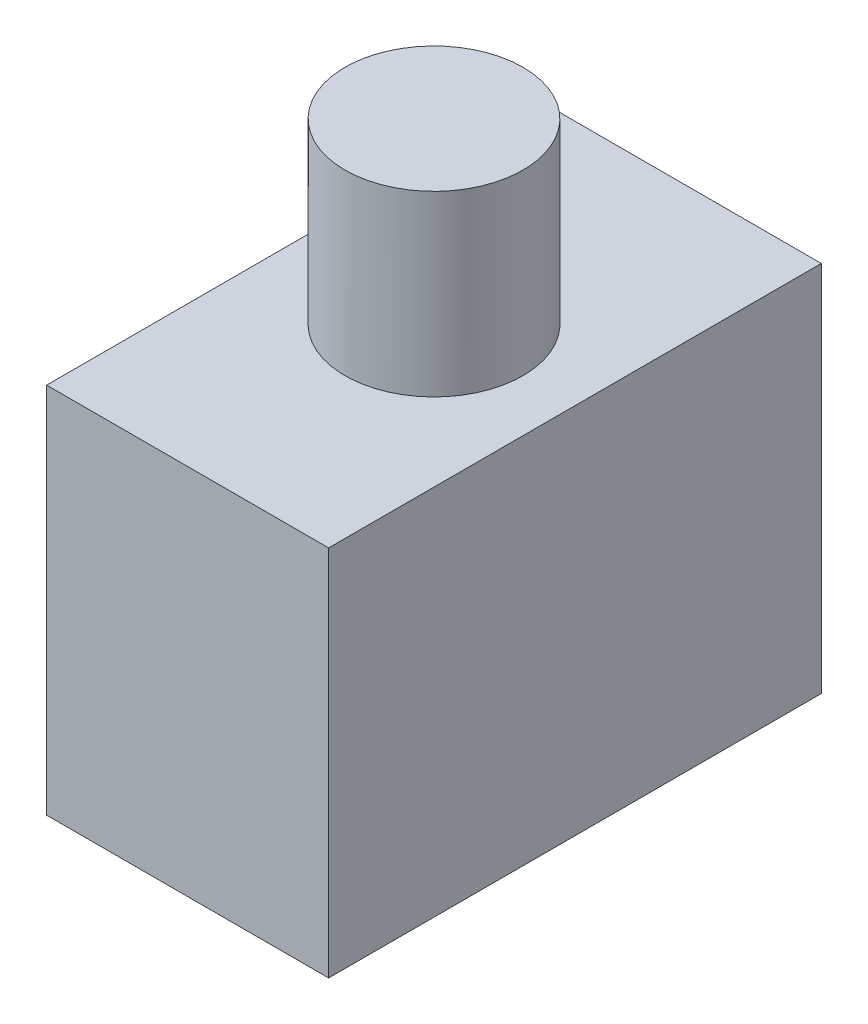
ISO-10303-21;
HEADER;
FILE_DESCRIPTION(('STEP AP214'),'2;1');
FILE_NAME('part.step','',(''),(''),'','','');
FILE_SCHEMA(('AUTOMOTIVE_DESIGN { 1 0 10303 214 1 1 1 1 }'));
ENDSEC;
DATA;
#1=APPLICATION_CONTEXT('core data for automotive mechanical design processes');
#2=APPLICATION_PROTOCOL_DEFINITION('international standard','automotive_design',2000,#1);
#3=PRODUCT_CONTEXT('',#1,'mechanical');
#4=PRODUCT('Part','Part','',(#3));
#5=PRODUCT_RELATED_PRODUCT_CATEGORY('part','',(#4));
#6=PRODUCT_DEFINITION_FORMATION('','',#4);
#7=PRODUCT_DEFINITION_CONTEXT('part definition',#1,'design');
#8=PRODUCT_DEFINITION('design','',#6,#7);
#9=PRODUCT_DEFINITION_SHAPE('','',#8);
#10=(LENGTH_UNIT() NAMED_UNIT(*) SI_UNIT(.MILLI.,.METRE.));
#11=(NAMED_UNIT(*) PLANE_ANGLE_UNIT() SI_UNIT($,.RADIAN.));
#12=(NAMED_UNIT(*) SI_UNIT($,.STERADIAN.) SOLID_ANGLE_UNIT());
#13=UNCERTAINTY_MEASURE_WITH_UNIT(LENGTH_MEASURE(1.E-05),#10,'distance_accuracy_value','');
#14=(GEOMETRIC_REPRESENTATION_CONTEXT(3) GLOBAL_UNCERTAINTY_ASSIGNED_CONTEXT((#13)) GLOBAL_UNIT_ASSIGNED_CONTEXT((#10,
#11,#12)) REPRESENTATION_CONTEXT('',''));
#15=CARTESIAN_POINT('',(0.,0.,0.));
#16=DIRECTION('',(0.,0.,1.));
#17=DIRECTION('',(1.,0.,0.));
#18=AXIS2_PLACEMENT_3D('',#15,#16,#17);
#19=CARTESIAN_POINT('',(9.5,25.1,-16.6));
#20=DIRECTION('',(0.,-1.,0.));
#21=DIRECTION('',(0.,0.,-1.));
#22=AXIS2_PLACEMENT_3D('',#19,#20,#21);
#23=PLANE('',#22);
#24=DIRECTION('',(0.,0.,-1.));
#25=VECTOR('',#24,1.);
#26=CARTESIAN_POINT('',(9.5,25.1,16.6));
#27=LINE('',#26,#25);
#28=CARTESIAN_POINT('',(9.5,25.1,16.6));
#29=VERTEX_POINT('',#28);
#30=CARTESIAN_POINT('',(9.5,25.1,-16.6));
#31=VERTEX_POINT('',#30);
#32=EDGE_CURVE('E86',#29,#31,#27,.T.);
#33=ORIENTED_EDGE('',*,*,#32,.T.);
#34=DIRECTION('',(-1.,0.,0.));
#35=VECTOR('',#34,1.);
#36=CARTESIAN_POINT('',(-9.5,25.1,-16.6));
#37=LINE('',#36,#35);
#38=CARTESIAN_POINT('',(-9.5,25.1,-16.6));
#39=VERTEX_POINT('',#38);
#40=EDGE_CURVE('E81',#31,#39,#37,.T.);
#41=ORIENTED_EDGE('',*,*,#40,.T.);
#42=DIRECTION('',(0.,0.,1.));
#43=VECTOR('',#42,1.);
#44=CARTESIAN_POINT('',(-9.5,25.1,16.6));
#45=LINE('',#44,#43);
#46=CARTESIAN_POINT('',(-9.5,25.1,16.6));
#47=VERTEX_POINT('',#46);
#48=EDGE_CURVE('E84',#39,#47,#45,.T.);
#49=ORIENTED_EDGE('',*,*,#48,.T.);
#50=DIRECTION('',(1.,0.,0.));
#51=VECTOR('',#50,1.);
#52=CARTESIAN_POINT('',(-9.5,25.1,16.6));
#53=LINE('',#52,#51);
#54=EDGE_CURVE('E50',#47,#29,#53,.T.);
#55=ORIENTED_EDGE('',*,*,#54,.T.);
#56=EDGE_LOOP('',(#33,#41,#49,#55));
#57=FACE_BOUND('',#56,.T.);
#58=CARTESIAN_POINT('',(0.,25.1,0.));
#59=DIRECTION('',(0.,-1.,0.));
#60=DIRECTION('',(0.,0.,-1.));
#61=AXIS2_PLACEMENT_3D('',#58,#59,#60);
#62=CIRCLE('',#61,6.);
#63=CARTESIAN_POINT('',(0.,25.1,-6.));
#64=VERTEX_POINT('',#63);
#65=EDGE_CURVE('E11',#64,#64,#62,.F.);
#66=ORIENTED_EDGE('',*,*,#65,.F.);
#67=EDGE_LOOP('',(#66));
#68=FACE_BOUND('',#67,.T.);
#69=ADVANCED_FACE('F33',(#57,#68),#23,.F.);
#70=CARTESIAN_POINT('',(9.5,25.1,16.6));
#71=DIRECTION('',(-1.,0.,0.));
#72=DIRECTION('',(0.,0.,1.));
#73=AXIS2_PLACEMENT_3D('',#70,#71,#72);
#74=PLANE('',#73);
#75=DIRECTION('',(0.,0.,-1.));
#76=VECTOR('',#75,1.);
#77=CARTESIAN_POINT('',(9.5,0.,16.6));
#78=LINE('',#77,#76);
#79=CARTESIAN_POINT('',(9.5,0.,16.6));
#80=VERTEX_POINT('',#79);
#81=CARTESIAN_POINT('',(9.5,0.,-16.6));
#82=VERTEX_POINT('',#81);
#83=EDGE_CURVE('E100',#80,#82,#78,.T.);
#84=ORIENTED_EDGE('',*,*,#83,.T.);
#85=DIRECTION('',(0.,-1.,0.));
#86=VECTOR('',#85,1.);
#87=CARTESIAN_POINT('',(9.5,25.1,-16.6));
#88=LINE('',#87,#86);
#89=EDGE_CURVE('E42',#31,#82,#88,.T.);
#90=ORIENTED_EDGE('',*,*,#89,.F.);
#91=ORIENTED_EDGE('',*,*,#32,.F.);
#92=DIRECTION('',(0.,-1.,0.));
#93=VECTOR('',#92,1.);
#94=CARTESIAN_POINT('',(9.5,25.1,16.6));
#95=LINE('',#94,#93);
#96=EDGE_CURVE('E96',#29,#80,#95,.T.);
#97=ORIENTED_EDGE('',*,*,#96,.T.);
#98=EDGE_LOOP('',(#84,#90,#91,#97));
#99=FACE_BOUND('',#98,.T.);
#100=ADVANCED_FACE('F35',(#99),#74,.F.);
#101=CARTESIAN_POINT('',(-9.5,25.1,-16.6));
#102=DIRECTION('',(0.,0.,1.));
#103=DIRECTION('',(1.,0.,0.));
#104=AXIS2_PLACEMENT_3D('',#101,#102,#103);
#105=PLANE('',#104);
#106=DIRECTION('',(-1.,0.,0.));
#107=VECTOR('',#106,1.);
#108=CARTESIAN_POINT('',(-9.5,0.,-16.6));
#109=LINE('',#108,#107);
#110=CARTESIAN_POINT('',(-9.5,0.,-16.6));
#111=VERTEX_POINT('',#110);
#112=EDGE_CURVE('E91',#82,#111,#109,.T.);
#113=ORIENTED_EDGE('',*,*,#112,.T.);
#114=DIRECTION('',(0.,-1.,0.));
#115=VECTOR('',#114,1.);
#116=CARTESIAN_POINT('',(-9.5,25.1,-16.6));
#117=LINE('',#116,#115);
#118=EDGE_CURVE('E89',#39,#111,#117,.T.);
#119=ORIENTED_EDGE('',*,*,#118,.F.);
#120=ORIENTED_EDGE('',*,*,#40,.F.);
#121=ORIENTED_EDGE('',*,*,#89,.T.);
#122=EDGE_LOOP('',(#113,#119,#120,#121));
#123=FACE_BOUND('',#122,.T.);
#124=ADVANCED_FACE('F90',(#123),#105,.F.);
#125=CARTESIAN_POINT('',(-9.5,25.1,16.6));
#126=DIRECTION('',(1.,0.,0.));
#127=DIRECTION('',(0.,0.,-1.));
#128=AXIS2_PLACEMENT_3D('',#125,#126,#127);
#129=PLANE('',#128);
#130=DIRECTION('',(0.,0.,1.));
#131=VECTOR('',#130,1.);
#132=CARTESIAN_POINT('',(-9.5,0.,16.6));
#133=LINE('',#132,#131);
#134=CARTESIAN_POINT('',(-9.5,0.,16.6));
#135=VERTEX_POINT('',#134);
#136=EDGE_CURVE('E67',#111,#135,#133,.T.);
#137=ORIENTED_EDGE('',*,*,#136,.T.);
#138=DIRECTION('',(0.,-1.,0.));
#139=VECTOR('',#138,1.);
#140=CARTESIAN_POINT('',(-9.5,25.1,16.6));
#141=LINE('',#140,#139);
#142=EDGE_CURVE('E92',#47,#135,#141,.T.);
#143=ORIENTED_EDGE('',*,*,#142,.F.);
#144=ORIENTED_EDGE('',*,*,#48,.F.);
#145=ORIENTED_EDGE('',*,*,#118,.T.);
#146=EDGE_LOOP('',(#137,#143,#144,#145));
#147=FACE_BOUND('',#146,.T.);
#148=ADVANCED_FACE('F94',(#147),#129,.F.);
#149=CARTESIAN_POINT('',(-9.5,25.1,16.6));
#150=DIRECTION('',(0.,0.,-1.));
#151=DIRECTION('',(-1.,0.,0.));
#152=AXIS2_PLACEMENT_3D('',#149,#150,#151);
#153=PLANE('',#152);
#154=DIRECTION('',(1.,0.,0.));
#155=VECTOR('',#154,1.);
#156=CARTESIAN_POINT('',(-9.5,0.,16.6));
#157=LINE('',#156,#155);
#158=EDGE_CURVE('E73',#135,#80,#157,.T.);
#159=ORIENTED_EDGE('',*,*,#158,.T.);
#160=ORIENTED_EDGE('',*,*,#96,.F.);
#161=ORIENTED_EDGE('',*,*,#54,.F.);
#162=ORIENTED_EDGE('',*,*,#142,.T.);
#163=EDGE_LOOP('',(#159,#160,#161,#162));
#164=FACE_BOUND('',#163,.T.);
#165=ADVANCED_FACE('F114',(#164),#153,.F.);
#166=CARTESIAN_POINT('',(9.5,0.,-16.6));
#167=DIRECTION('',(0.,-1.,0.));
#168=DIRECTION('',(0.,0.,-1.));
#169=AXIS2_PLACEMENT_3D('',#166,#167,#168);
#170=PLANE('',#169);
#171=ORIENTED_EDGE('',*,*,#83,.F.);
#172=ORIENTED_EDGE('',*,*,#158,.F.);
#173=ORIENTED_EDGE('',*,*,#136,.F.);
#174=ORIENTED_EDGE('',*,*,#112,.F.);
#175=EDGE_LOOP('',(#171,#172,#173,#174));
#176=FACE_BOUND('',#175,.T.);
#177=ADVANCED_FACE('F111',(#176),#170,.T.);
#178=CARTESIAN_POINT('',(0.,37.1,0.));
#179=DIRECTION('',(0.,-1.,0.));
#180=DIRECTION('',(0.,0.,-1.));
#181=AXIS2_PLACEMENT_3D('',#178,#179,#180);
#182=CYLINDRICAL_SURFACE('',#181,6.);
#183=CARTESIAN_POINT('',(0.,37.1,0.));
#184=DIRECTION('',(0.,1.,0.));
#185=DIRECTION('',(0.,0.,1.));
#186=AXIS2_PLACEMENT_3D('',#183,#184,#185);
#187=CIRCLE('',#186,6.);
#188=CARTESIAN_POINT('',(0.,37.1,6.));
#189=VERTEX_POINT('',#188);
#190=EDGE_CURVE('E103',#189,#189,#187,.T.);
#191=ORIENTED_EDGE('',*,*,#190,.F.);
#192=EDGE_LOOP('',(#191));
#193=FACE_BOUND('',#192,.T.);
#194=ORIENTED_EDGE('',*,*,#65,.T.);
#195=EDGE_LOOP('',(#194));
#196=FACE_BOUND('',#195,.T.);
#197=ADVANCED_FACE('F113',(#193,#196),#182,.T.);
#198=CARTESIAN_POINT('',(0.,37.1,0.));
#199=DIRECTION('',(0.,1.,0.));
#200=DIRECTION('',(0.,0.,1.));
#201=AXIS2_PLACEMENT_3D('',#198,#199,#200);
#202=PLANE('',#201);
#203=ORIENTED_EDGE('',*,*,#190,.T.);
#204=EDGE_LOOP('',(#203));
#205=FACE_BOUND('',#204,.T.);
#206=ADVANCED_FACE('F120',(#205),#202,.T.);
#207=CLOSED_SHELL('',(#69,#100,#124,#148,#165,#177,#197,#206));
#208=MANIFOLD_SOLID_BREP('B2',#207);
#209=ADVANCED_BREP_SHAPE_REPRESENTATION('',(#18,#208),#14);
#210=SHAPE_DEFINITION_REPRESENTATION(#9,#209);
ENDSEC;
END-ISO-10303-21;
